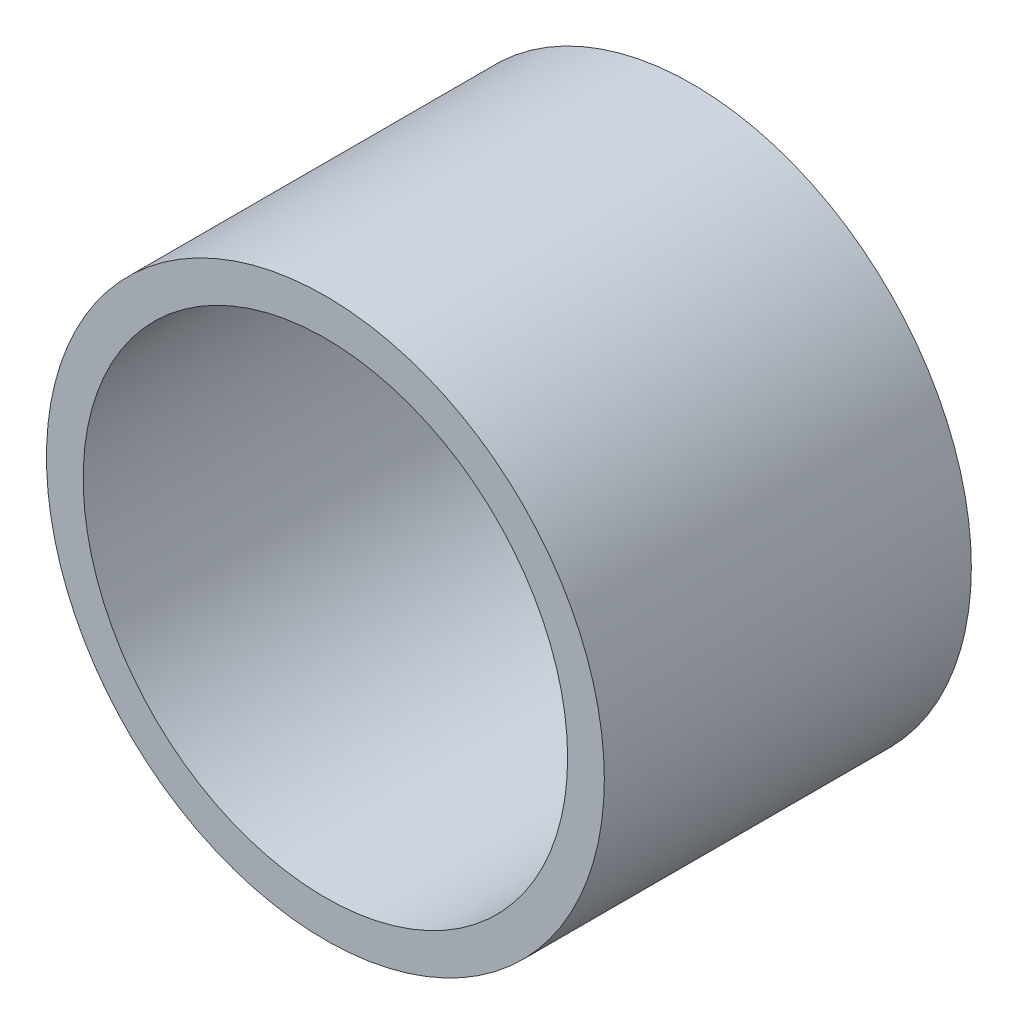
ISO-10303-21;
HEADER;
FILE_DESCRIPTION(('STEP AP214'),'2;1');
FILE_NAME('part.step','',(''),(''),'','','');
FILE_SCHEMA(('AUTOMOTIVE_DESIGN { 1 0 10303 214 1 1 1 1 }'));
ENDSEC;
DATA;
#1=APPLICATION_CONTEXT('core data for automotive mechanical design processes');
#2=APPLICATION_PROTOCOL_DEFINITION('international standard','automotive_design',2000,#1);
#3=PRODUCT_CONTEXT('',#1,'mechanical');
#4=PRODUCT('Part','Part','',(#3));
#5=PRODUCT_RELATED_PRODUCT_CATEGORY('part','',(#4));
#6=PRODUCT_DEFINITION_FORMATION('','',#4);
#7=PRODUCT_DEFINITION_CONTEXT('part definition',#1,'design');
#8=PRODUCT_DEFINITION('design','',#6,#7);
#9=PRODUCT_DEFINITION_SHAPE('','',#8);
#10=(LENGTH_UNIT() NAMED_UNIT(*) SI_UNIT(.MILLI.,.METRE.));
#11=(NAMED_UNIT(*) PLANE_ANGLE_UNIT() SI_UNIT($,.RADIAN.));
#12=(NAMED_UNIT(*) SI_UNIT($,.STERADIAN.) SOLID_ANGLE_UNIT());
#13=UNCERTAINTY_MEASURE_WITH_UNIT(LENGTH_MEASURE(1.E-05),#10,'distance_accuracy_value','');
#14=(GEOMETRIC_REPRESENTATION_CONTEXT(3) GLOBAL_UNCERTAINTY_ASSIGNED_CONTEXT((#13)) GLOBAL_UNIT_ASSIGNED_CONTEXT((#10,
#11,#12)) REPRESENTATION_CONTEXT('',''));
#15=CARTESIAN_POINT('',(0.,0.,0.));
#16=DIRECTION('',(0.,0.,1.));
#17=DIRECTION('',(1.,0.,0.));
#18=AXIS2_PLACEMENT_3D('',#15,#16,#17);
#19=CARTESIAN_POINT('',(0.,0.,2.5));
#20=DIRECTION('',(0.,0.,1.));
#21=DIRECTION('',(1.,0.,0.));
#22=AXIS2_PLACEMENT_3D('',#19,#20,#21);
#23=PLANE('',#22);
#24=CARTESIAN_POINT('',(0.,0.,2.5));
#25=DIRECTION('',(0.,0.,1.));
#26=DIRECTION('',(1.,0.,0.));
#27=AXIS2_PLACEMENT_3D('',#24,#25,#26);
#28=CIRCLE('',#27,1.9);
#29=CARTESIAN_POINT('',(1.9,0.,2.5));
#30=VERTEX_POINT('',#29);
#31=EDGE_CURVE('E10',#30,#30,#28,.T.);
#32=ORIENTED_EDGE('',*,*,#31,.T.);
#33=EDGE_LOOP('',(#32));
#34=FACE_BOUND('',#33,.T.);
#35=CARTESIAN_POINT('',(0.,0.,2.5));
#36=DIRECTION('',(0.,0.,1.));
#37=DIRECTION('',(1.,0.,0.));
#38=AXIS2_PLACEMENT_3D('',#35,#36,#37);
#39=CIRCLE('',#38,1.65);
#40=CARTESIAN_POINT('',(1.65,0.,2.5));
#41=VERTEX_POINT('',#40);
#42=EDGE_CURVE('E44',#41,#41,#39,.T.);
#43=ORIENTED_EDGE('',*,*,#42,.F.);
#44=EDGE_LOOP('',(#43));
#45=FACE_BOUND('',#44,.T.);
#46=ADVANCED_FACE('F33',(#34,#45),#23,.T.);
#47=CARTESIAN_POINT('',(0.,0.,0.));
#48=DIRECTION('',(0.,0.,1.));
#49=DIRECTION('',(1.,0.,0.));
#50=AXIS2_PLACEMENT_3D('',#47,#48,#49);
#51=PLANE('',#50);
#52=CARTESIAN_POINT('',(0.,0.,0.));
#53=DIRECTION('',(0.,0.,1.));
#54=DIRECTION('',(1.,0.,0.));
#55=AXIS2_PLACEMENT_3D('',#52,#53,#54);
#56=CIRCLE('',#55,1.9);
#57=CARTESIAN_POINT('',(1.9,0.,0.));
#58=VERTEX_POINT('',#57);
#59=EDGE_CURVE('E37',#58,#58,#56,.T.);
#60=ORIENTED_EDGE('',*,*,#59,.F.);
#61=EDGE_LOOP('',(#60));
#62=FACE_BOUND('',#61,.T.);
#63=CARTESIAN_POINT('',(0.,0.,0.));
#64=DIRECTION('',(0.,0.,1.));
#65=DIRECTION('',(1.,0.,0.));
#66=AXIS2_PLACEMENT_3D('',#63,#64,#65);
#67=CIRCLE('',#66,1.65);
#68=CARTESIAN_POINT('',(1.65,0.,0.));
#69=VERTEX_POINT('',#68);
#70=EDGE_CURVE('E46',#69,#69,#67,.T.);
#71=ORIENTED_EDGE('',*,*,#70,.T.);
#72=EDGE_LOOP('',(#71));
#73=FACE_BOUND('',#72,.T.);
#74=ADVANCED_FACE('F56',(#62,#73),#51,.F.);
#75=CARTESIAN_POINT('',(0.,0.,2.5));
#76=DIRECTION('',(0.,0.,-1.));
#77=DIRECTION('',(-1.,0.,0.));
#78=AXIS2_PLACEMENT_3D('',#75,#76,#77);
#79=CYLINDRICAL_SURFACE('',#78,1.9);
#80=ORIENTED_EDGE('',*,*,#31,.F.);
#81=EDGE_LOOP('',(#80));
#82=FACE_BOUND('',#81,.T.);
#83=ORIENTED_EDGE('',*,*,#59,.T.);
#84=EDGE_LOOP('',(#83));
#85=FACE_BOUND('',#84,.T.);
#86=ADVANCED_FACE('F35',(#82,#85),#79,.T.);
#87=CARTESIAN_POINT('',(0.,0.,2.5));
#88=DIRECTION('',(0.,0.,-1.));
#89=DIRECTION('',(-1.,0.,0.));
#90=AXIS2_PLACEMENT_3D('',#87,#88,#89);
#91=CYLINDRICAL_SURFACE('',#90,1.65);
#92=ORIENTED_EDGE('',*,*,#42,.T.);
#93=EDGE_LOOP('',(#92));
#94=FACE_BOUND('',#93,.T.);
#95=ORIENTED_EDGE('',*,*,#70,.F.);
#96=EDGE_LOOP('',(#95));
#97=FACE_BOUND('',#96,.T.);
#98=ADVANCED_FACE('F52',(#94,#97),#91,.F.);
#99=CLOSED_SHELL('',(#46,#74,#86,#98));
#100=MANIFOLD_SOLID_BREP('B2',#99);
#101=ADVANCED_BREP_SHAPE_REPRESENTATION('',(#18,#100),#14);
#102=SHAPE_DEFINITION_REPRESENTATION(#9,#101);
ENDSEC;
END-ISO-10303-21;
